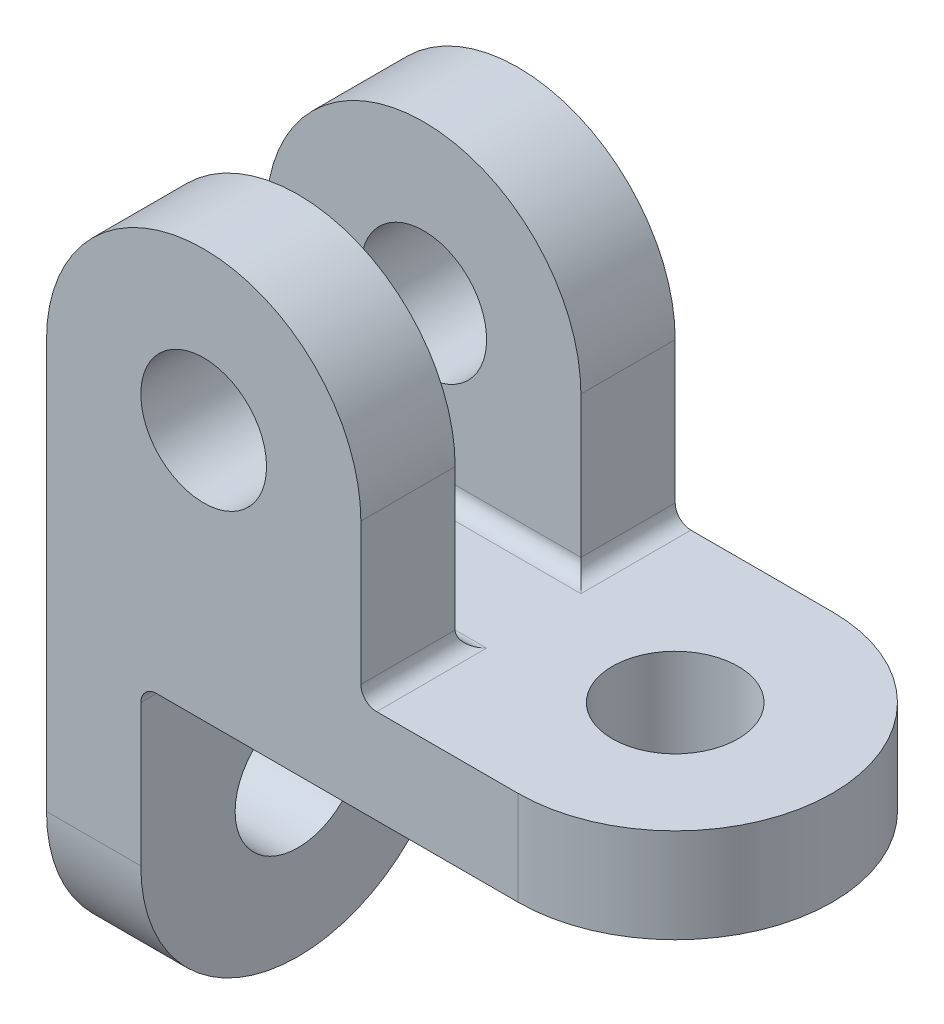
ISO-10303-21;
HEADER;
FILE_DESCRIPTION(('STEP AP214'),'2;1');
FILE_NAME('part.step','',(''),(''),'','','');
FILE_SCHEMA(('AUTOMOTIVE_DESIGN { 1 0 10303 214 1 1 1 1 }'));
ENDSEC;
DATA;
#1=APPLICATION_CONTEXT('core data for automotive mechanical design processes');
#2=APPLICATION_PROTOCOL_DEFINITION('international standard','automotive_design',2000,#1);
#3=PRODUCT_CONTEXT('',#1,'mechanical');
#4=PRODUCT('Part','Part','',(#3));
#5=PRODUCT_RELATED_PRODUCT_CATEGORY('part','',(#4));
#6=PRODUCT_DEFINITION_FORMATION('','',#4);
#7=PRODUCT_DEFINITION_CONTEXT('part definition',#1,'design');
#8=PRODUCT_DEFINITION('design','',#6,#7);
#9=PRODUCT_DEFINITION_SHAPE('','',#8);
#10=(LENGTH_UNIT() NAMED_UNIT(*) SI_UNIT(.MILLI.,.METRE.));
#11=(NAMED_UNIT(*) PLANE_ANGLE_UNIT() SI_UNIT($,.RADIAN.));
#12=(NAMED_UNIT(*) SI_UNIT($,.STERADIAN.) SOLID_ANGLE_UNIT());
#13=UNCERTAINTY_MEASURE_WITH_UNIT(LENGTH_MEASURE(1.E-05),#10,'distance_accuracy_value','');
#14=(GEOMETRIC_REPRESENTATION_CONTEXT(3) GLOBAL_UNCERTAINTY_ASSIGNED_CONTEXT((#13)) GLOBAL_UNIT_ASSIGNED_CONTEXT((#10,
#11,#12)) REPRESENTATION_CONTEXT('',''));
#15=CARTESIAN_POINT('',(0.,0.,0.));
#16=DIRECTION('',(0.,0.,1.));
#17=DIRECTION('',(1.,0.,0.));
#18=AXIS2_PLACEMENT_3D('',#15,#16,#17);
#19=CARTESIAN_POINT('',(30.,0.,0.));
#20=DIRECTION('',(0.,-1.,0.));
#21=DIRECTION('',(0.,0.,-1.));
#22=AXIS2_PLACEMENT_3D('',#19,#20,#21);
#23=PLANE('',#22);
#24=CARTESIAN_POINT('',(30.,0.,0.));
#25=DIRECTION('',(0.,1.,0.));
#26=DIRECTION('',(0.,0.,1.));
#27=AXIS2_PLACEMENT_3D('',#24,#25,#26);
#28=CIRCLE('',#27,8.);
#29=CARTESIAN_POINT('',(30.,0.,7.99999999999999));
#30=VERTEX_POINT('',#29);
#31=EDGE_CURVE('E236',#30,#30,#28,.T.);
#32=ORIENTED_EDGE('',*,*,#31,.T.);
#33=EDGE_LOOP('',(#32));
#34=FACE_BOUND('',#33,.T.);
#35=DIRECTION('',(1.,0.,0.));
#36=VECTOR('',#35,1.);
#37=CARTESIAN_POINT('',(-30.,0.,20.));
#38=LINE('',#37,#36);
#39=CARTESIAN_POINT('',(-16.,0.,20.));
#40=VERTEX_POINT('',#39);
#41=CARTESIAN_POINT('',(30.,0.,20.));
#42=VERTEX_POINT('',#41);
#43=EDGE_CURVE('E256',#40,#42,#38,.T.);
#44=ORIENTED_EDGE('',*,*,#43,.F.);
#45=DIRECTION('',(0.,0.,-1.));
#46=VECTOR('',#45,1.);
#47=CARTESIAN_POINT('',(-16.,0.,0.));
#48=LINE('',#47,#46);
#49=CARTESIAN_POINT('',(-16.,0.,-20.));
#50=VERTEX_POINT('',#49);
#51=EDGE_CURVE('E267',#40,#50,#48,.T.);
#52=ORIENTED_EDGE('',*,*,#51,.T.);
#53=DIRECTION('',(-1.,0.,0.));
#54=VECTOR('',#53,1.);
#55=CARTESIAN_POINT('',(30.,0.,-20.));
#56=LINE('',#55,#54);
#57=CARTESIAN_POINT('',(30.,0.,-20.));
#58=VERTEX_POINT('',#57);
#59=EDGE_CURVE('E239',#58,#50,#56,.T.);
#60=ORIENTED_EDGE('',*,*,#59,.F.);
#61=CARTESIAN_POINT('',(30.,0.,0.));
#62=DIRECTION('',(0.,1.,0.));
#63=DIRECTION('',(0.,0.,-1.));
#64=AXIS2_PLACEMENT_3D('',#61,#62,#63);
#65=CIRCLE('',#64,20.);
#66=EDGE_CURVE('E246',#42,#58,#65,.T.);
#67=ORIENTED_EDGE('',*,*,#66,.F.);
#68=EDGE_LOOP('',(#44,#52,#60,#67));
#69=FACE_BOUND('',#68,.T.);
#70=ADVANCED_FACE('F37',(#34,#69),#23,.T.);
#71=CARTESIAN_POINT('',(30.,12.,-20.));
#72=DIRECTION('',(0.,0.,1.));
#73=DIRECTION('',(1.,0.,0.));
#74=AXIS2_PLACEMENT_3D('',#71,#72,#73);
#75=PLANE('',#74);
#76=ORIENTED_EDGE('',*,*,#59,.T.);
#77=CARTESIAN_POINT('',(-16.,-2.,-20.));
#78=DIRECTION('',(0.,0.,1.));
#79=DIRECTION('',(1.,0.,0.));
#80=AXIS2_PLACEMENT_3D('',#77,#78,#79);
#81=CIRCLE('',#80,2.);
#82=CARTESIAN_POINT('',(-18.,-2.,-20.));
#83=VERTEX_POINT('',#82);
#84=EDGE_CURVE('E288',#50,#83,#81,.T.);
#85=ORIENTED_EDGE('',*,*,#84,.T.);
#86=DIRECTION('',(0.,-1.,0.));
#87=VECTOR('',#86,1.);
#88=CARTESIAN_POINT('',(-18.,-20.,-20.));
#89=LINE('',#88,#87);
#90=CARTESIAN_POINT('',(-18.,-20.,-20.));
#91=VERTEX_POINT('',#90);
#92=EDGE_CURVE('E165',#83,#91,#89,.T.);
#93=ORIENTED_EDGE('',*,*,#92,.T.);
#94=DIRECTION('',(-1.,0.,0.));
#95=VECTOR('',#94,1.);
#96=CARTESIAN_POINT('',(-18.,-20.,-20.));
#97=LINE('',#96,#95);
#98=CARTESIAN_POINT('',(-30.,-20.,-20.));
#99=VERTEX_POINT('',#98);
#100=EDGE_CURVE('E164',#91,#99,#97,.T.);
#101=ORIENTED_EDGE('',*,*,#100,.T.);
#102=DIRECTION('',(0.,-1.,0.));
#103=VECTOR('',#102,1.);
#104=CARTESIAN_POINT('',(-30.,12.,-20.));
#105=LINE('',#104,#103);
#106=CARTESIAN_POINT('',(-30.,32.,-20.));
#107=VERTEX_POINT('',#106);
#108=EDGE_CURVE('E265',#107,#99,#105,.T.);
#109=ORIENTED_EDGE('',*,*,#108,.F.);
#110=CARTESIAN_POINT('',(-10.,32.,-20.));
#111=DIRECTION('',(0.,0.,-1.));
#112=DIRECTION('',(1.,0.,0.));
#113=AXIS2_PLACEMENT_3D('',#110,#111,#112);
#114=CIRCLE('',#113,20.);
#115=CARTESIAN_POINT('',(10.,32.,-20.));
#116=VERTEX_POINT('',#115);
#117=EDGE_CURVE('E192',#107,#116,#114,.T.);
#118=ORIENTED_EDGE('',*,*,#117,.T.);
#119=DIRECTION('',(0.,-1.,0.));
#120=VECTOR('',#119,1.);
#121=CARTESIAN_POINT('',(10.,32.,-20.));
#122=LINE('',#121,#120);
#123=CARTESIAN_POINT('',(10.,14.,-20.));
#124=VERTEX_POINT('',#123);
#125=EDGE_CURVE('E199',#116,#124,#122,.T.);
#126=ORIENTED_EDGE('',*,*,#125,.T.);
#127=CARTESIAN_POINT('',(12.,14.,-20.));
#128=DIRECTION('',(0.,0.,1.));
#129=DIRECTION('',(1.,0.,0.));
#130=AXIS2_PLACEMENT_3D('',#127,#128,#129);
#131=CIRCLE('',#130,2.);
#132=CARTESIAN_POINT('',(12.,12.,-20.));
#133=VERTEX_POINT('',#132);
#134=EDGE_CURVE('E46',#124,#133,#131,.T.);
#135=ORIENTED_EDGE('',*,*,#134,.T.);
#136=DIRECTION('',(-1.,0.,0.));
#137=VECTOR('',#136,1.);
#138=CARTESIAN_POINT('',(30.,12.,-20.));
#139=LINE('',#138,#137);
#140=CARTESIAN_POINT('',(30.,12.,-20.));
#141=VERTEX_POINT('',#140);
#142=EDGE_CURVE('E242',#141,#133,#139,.T.);
#143=ORIENTED_EDGE('',*,*,#142,.F.);
#144=DIRECTION('',(0.,-1.,0.));
#145=VECTOR('',#144,1.);
#146=CARTESIAN_POINT('',(30.,12.,-20.));
#147=LINE('',#146,#145);
#148=EDGE_CURVE('E253',#141,#58,#147,.T.);
#149=ORIENTED_EDGE('',*,*,#148,.T.);
#150=EDGE_LOOP('',(#76,#85,#93,#101,#109,#118,#126,#135,#143,#149));
#151=FACE_BOUND('',#150,.T.);
#152=CARTESIAN_POINT('',(-10.,32.,-20.));
#153=DIRECTION('',(0.,0.,-1.));
#154=DIRECTION('',(-1.,0.,0.));
#155=AXIS2_PLACEMENT_3D('',#152,#153,#154);
#156=CIRCLE('',#155,8.);
#157=CARTESIAN_POINT('',(-18.,32.,-20.));
#158=VERTEX_POINT('',#157);
#159=EDGE_CURVE('E187',#158,#158,#156,.T.);
#160=ORIENTED_EDGE('',*,*,#159,.F.);
#161=EDGE_LOOP('',(#160));
#162=FACE_BOUND('',#161,.T.);
#163=ADVANCED_FACE('F314',(#151,#162),#75,.F.);
#164=CARTESIAN_POINT('',(-30.,12.,-20.));
#165=DIRECTION('',(1.,0.,0.));
#166=DIRECTION('',(0.,0.,-1.));
#167=AXIS2_PLACEMENT_3D('',#164,#165,#166);
#168=PLANE('',#167);
#169=ORIENTED_EDGE('',*,*,#108,.T.);
#170=CARTESIAN_POINT('',(-30.,-20.,0.));
#171=DIRECTION('',(-1.,0.,0.));
#172=DIRECTION('',(0.,0.,1.));
#173=AXIS2_PLACEMENT_3D('',#170,#171,#172);
#174=CIRCLE('',#173,20.);
#175=CARTESIAN_POINT('',(-30.,-20.,20.));
#176=VERTEX_POINT('',#175);
#177=EDGE_CURVE('E178',#99,#176,#174,.T.);
#178=ORIENTED_EDGE('',*,*,#177,.T.);
#179=DIRECTION('',(0.,-1.,0.));
#180=VECTOR('',#179,1.);
#181=CARTESIAN_POINT('',(-30.,12.,20.));
#182=LINE('',#181,#180);
#183=CARTESIAN_POINT('',(-30.,32.,20.));
#184=VERTEX_POINT('',#183);
#185=EDGE_CURVE('E159',#184,#176,#182,.T.);
#186=ORIENTED_EDGE('',*,*,#185,.F.);
#187=DIRECTION('',(0.,0.,1.));
#188=VECTOR('',#187,1.);
#189=CARTESIAN_POINT('',(-30.,32.,8.));
#190=LINE('',#189,#188);
#191=CARTESIAN_POINT('',(-30.,32.,8.));
#192=VERTEX_POINT('',#191);
#193=EDGE_CURVE('E227',#192,#184,#190,.T.);
#194=ORIENTED_EDGE('',*,*,#193,.F.);
#195=DIRECTION('',(0.,-1.,0.));
#196=VECTOR('',#195,1.);
#197=CARTESIAN_POINT('',(-30.,32.,8.));
#198=LINE('',#197,#196);
#199=CARTESIAN_POINT('',(-30.,14.,8.));
#200=VERTEX_POINT('',#199);
#201=EDGE_CURVE('E221',#192,#200,#198,.T.);
#202=ORIENTED_EDGE('',*,*,#201,.T.);
#203=CARTESIAN_POINT('',(-30.,14.,6.));
#204=DIRECTION('',(1.,0.,0.));
#205=DIRECTION('',(0.,0.,-1.));
#206=AXIS2_PLACEMENT_3D('',#203,#204,#205);
#207=CIRCLE('',#206,2.);
#208=CARTESIAN_POINT('',(-30.,12.,6.));
#209=VERTEX_POINT('',#208);
#210=EDGE_CURVE('E292',#200,#209,#207,.T.);
#211=ORIENTED_EDGE('',*,*,#210,.T.);
#212=DIRECTION('',(0.,0.,1.));
#213=VECTOR('',#212,1.);
#214=CARTESIAN_POINT('',(-30.,12.,-20.));
#215=LINE('',#214,#213);
#216=CARTESIAN_POINT('',(-30.,12.,-6.));
#217=VERTEX_POINT('',#216);
#218=EDGE_CURVE('E245',#217,#209,#215,.T.);
#219=ORIENTED_EDGE('',*,*,#218,.F.);
#220=CARTESIAN_POINT('',(-30.,14.,-6.));
#221=DIRECTION('',(1.,0.,0.));
#222=DIRECTION('',(0.,0.,-1.));
#223=AXIS2_PLACEMENT_3D('',#220,#221,#222);
#224=CIRCLE('',#223,2.);
#225=CARTESIAN_POINT('',(-30.,14.,-8.));
#226=VERTEX_POINT('',#225);
#227=EDGE_CURVE('E294',#217,#226,#224,.T.);
#228=ORIENTED_EDGE('',*,*,#227,.T.);
#229=DIRECTION('',(0.,1.,0.));
#230=VECTOR('',#229,1.);
#231=CARTESIAN_POINT('',(-30.,12.,-8.));
#232=LINE('',#231,#230);
#233=CARTESIAN_POINT('',(-30.,32.,-8.));
#234=VERTEX_POINT('',#233);
#235=EDGE_CURVE('E201',#226,#234,#232,.T.);
#236=ORIENTED_EDGE('',*,*,#235,.T.);
#237=DIRECTION('',(0.,0.,-1.));
#238=VECTOR('',#237,1.);
#239=CARTESIAN_POINT('',(-30.,32.,-8.));
#240=LINE('',#239,#238);
#241=EDGE_CURVE('E207',#234,#107,#240,.T.);
#242=ORIENTED_EDGE('',*,*,#241,.T.);
#243=EDGE_LOOP('',(#169,#178,#186,#194,#202,#211,#219,#228,#236,#242));
#244=FACE_BOUND('',#243,.T.);
#245=CARTESIAN_POINT('',(-30.,-20.,0.));
#246=DIRECTION('',(-1.,0.,0.));
#247=DIRECTION('',(0.,0.,1.));
#248=AXIS2_PLACEMENT_3D('',#245,#246,#247);
#249=CIRCLE('',#248,8.);
#250=CARTESIAN_POINT('',(-30.,-20.,8.));
#251=VERTEX_POINT('',#250);
#252=EDGE_CURVE('E183',#251,#251,#249,.T.);
#253=ORIENTED_EDGE('',*,*,#252,.F.);
#254=EDGE_LOOP('',(#253));
#255=FACE_BOUND('',#254,.T.);
#256=ADVANCED_FACE('F331',(#244,#255),#168,.F.);
#257=CARTESIAN_POINT('',(-30.,12.,20.));
#258=DIRECTION('',(0.,0.,-1.));
#259=DIRECTION('',(-1.,0.,0.));
#260=AXIS2_PLACEMENT_3D('',#257,#258,#259);
#261=PLANE('',#260);
#262=ORIENTED_EDGE('',*,*,#185,.T.);
#263=DIRECTION('',(-1.,0.,0.));
#264=VECTOR('',#263,1.);
#265=CARTESIAN_POINT('',(-18.,-20.,20.));
#266=LINE('',#265,#264);
#267=CARTESIAN_POINT('',(-18.,-20.,20.));
#268=VERTEX_POINT('',#267);
#269=EDGE_CURVE('E152',#268,#176,#266,.T.);
#270=ORIENTED_EDGE('',*,*,#269,.F.);
#271=DIRECTION('',(0.,1.,0.));
#272=VECTOR('',#271,1.);
#273=CARTESIAN_POINT('',(-18.,0.,20.));
#274=LINE('',#273,#272);
#275=CARTESIAN_POINT('',(-18.,-2.,20.));
#276=VERTEX_POINT('',#275);
#277=EDGE_CURVE('E156',#268,#276,#274,.T.);
#278=ORIENTED_EDGE('',*,*,#277,.T.);
#279=CARTESIAN_POINT('',(-16.,-2.,20.));
#280=DIRECTION('',(0.,0.,-1.));
#281=DIRECTION('',(-1.,0.,0.));
#282=AXIS2_PLACEMENT_3D('',#279,#280,#281);
#283=CIRCLE('',#282,2.);
#284=EDGE_CURVE('E290',#276,#40,#283,.T.);
#285=ORIENTED_EDGE('',*,*,#284,.T.);
#286=ORIENTED_EDGE('',*,*,#43,.T.);
#287=DIRECTION('',(0.,-1.,0.));
#288=VECTOR('',#287,1.);
#289=CARTESIAN_POINT('',(30.,12.,20.));
#290=LINE('',#289,#288);
#291=CARTESIAN_POINT('',(30.,12.,20.));
#292=VERTEX_POINT('',#291);
#293=EDGE_CURVE('E261',#292,#42,#290,.T.);
#294=ORIENTED_EDGE('',*,*,#293,.F.);
#295=DIRECTION('',(1.,0.,0.));
#296=VECTOR('',#295,1.);
#297=CARTESIAN_POINT('',(-30.,12.,20.));
#298=LINE('',#297,#296);
#299=CARTESIAN_POINT('',(12.,12.,20.));
#300=VERTEX_POINT('',#299);
#301=EDGE_CURVE('E249',#300,#292,#298,.T.);
#302=ORIENTED_EDGE('',*,*,#301,.F.);
#303=CARTESIAN_POINT('',(12.,14.,20.));
#304=DIRECTION('',(0.,0.,-1.));
#305=DIRECTION('',(-1.,0.,0.));
#306=AXIS2_PLACEMENT_3D('',#303,#304,#305);
#307=CIRCLE('',#306,2.);
#308=CARTESIAN_POINT('',(10.,14.,20.));
#309=VERTEX_POINT('',#308);
#310=EDGE_CURVE('E11',#300,#309,#307,.T.);
#311=ORIENTED_EDGE('',*,*,#310,.T.);
#312=DIRECTION('',(0.,1.,0.));
#313=VECTOR('',#312,1.);
#314=CARTESIAN_POINT('',(10.,12.,20.));
#315=LINE('',#314,#313);
#316=CARTESIAN_POINT('',(10.,32.,20.));
#317=VERTEX_POINT('',#316);
#318=EDGE_CURVE('E222',#309,#317,#315,.T.);
#319=ORIENTED_EDGE('',*,*,#318,.T.);
#320=CARTESIAN_POINT('',(-10.,32.,20.));
#321=DIRECTION('',(0.,0.,1.));
#322=DIRECTION('',(-1.,0.,0.));
#323=AXIS2_PLACEMENT_3D('',#320,#321,#322);
#324=CIRCLE('',#323,20.);
#325=EDGE_CURVE('E215',#317,#184,#324,.T.);
#326=ORIENTED_EDGE('',*,*,#325,.T.);
#327=EDGE_LOOP('',(#262,#270,#278,#285,#286,#294,#302,#311,#319,#326));
#328=FACE_BOUND('',#327,.T.);
#329=CARTESIAN_POINT('',(-10.,32.,20.));
#330=DIRECTION('',(0.,0.,1.));
#331=DIRECTION('',(1.,0.,0.));
#332=AXIS2_PLACEMENT_3D('',#329,#330,#331);
#333=CIRCLE('',#332,8.);
#334=CARTESIAN_POINT('',(-2.,32.,20.));
#335=VERTEX_POINT('',#334);
#336=EDGE_CURVE('E210',#335,#335,#333,.T.);
#337=ORIENTED_EDGE('',*,*,#336,.F.);
#338=EDGE_LOOP('',(#337));
#339=FACE_BOUND('',#338,.T.);
#340=ADVANCED_FACE('F154',(#328,#339),#261,.F.);
#341=CARTESIAN_POINT('',(30.,12.,0.));
#342=DIRECTION('',(0.,-1.,0.));
#343=DIRECTION('',(0.,0.,-1.));
#344=AXIS2_PLACEMENT_3D('',#341,#342,#343);
#345=CYLINDRICAL_SURFACE('',#344,20.);
#346=ORIENTED_EDGE('',*,*,#66,.T.);
#347=ORIENTED_EDGE('',*,*,#148,.F.);
#348=CARTESIAN_POINT('',(30.,12.,0.));
#349=DIRECTION('',(0.,1.,0.));
#350=DIRECTION('',(0.,0.,-1.));
#351=AXIS2_PLACEMENT_3D('',#348,#349,#350);
#352=CIRCLE('',#351,20.);
#353=EDGE_CURVE('E251',#292,#141,#352,.T.);
#354=ORIENTED_EDGE('',*,*,#353,.F.);
#355=ORIENTED_EDGE('',*,*,#293,.T.);
#356=EDGE_LOOP('',(#346,#347,#354,#355));
#357=FACE_BOUND('',#356,.T.);
#358=ADVANCED_FACE('F322',(#357),#345,.T.);
#359=CARTESIAN_POINT('',(30.,12.,0.));
#360=DIRECTION('',(0.,-1.,0.));
#361=DIRECTION('',(0.,0.,-1.));
#362=AXIS2_PLACEMENT_3D('',#359,#360,#361);
#363=PLANE('',#362);
#364=CARTESIAN_POINT('',(30.,12.,0.));
#365=DIRECTION('',(0.,1.,0.));
#366=DIRECTION('',(0.,0.,1.));
#367=AXIS2_PLACEMENT_3D('',#364,#365,#366);
#368=CIRCLE('',#367,8.);
#369=CARTESIAN_POINT('',(30.,12.,7.99999999999999));
#370=VERTEX_POINT('',#369);
#371=EDGE_CURVE('E233',#370,#370,#368,.T.);
#372=ORIENTED_EDGE('',*,*,#371,.F.);
#373=EDGE_LOOP('',(#372));
#374=FACE_BOUND('',#373,.T.);
#375=DIRECTION('',(0.,0.,-1.));
#376=VECTOR('',#375,1.);
#377=CARTESIAN_POINT('',(12.,12.,0.));
#378=LINE('',#377,#376);
#379=CARTESIAN_POINT('',(12.,12.,-6.00000000000001));
#380=VERTEX_POINT('',#379);
#381=EDGE_CURVE('E276',#133,#380,#378,.F.);
#382=ORIENTED_EDGE('',*,*,#381,.T.);
#383=DIRECTION('',(-1.,0.,0.));
#384=VECTOR('',#383,1.);
#385=CARTESIAN_POINT('',(30.,12.,-6.00000000000001));
#386=LINE('',#385,#384);
#387=EDGE_CURVE('E278',#380,#217,#386,.T.);
#388=ORIENTED_EDGE('',*,*,#387,.T.);
#389=ORIENTED_EDGE('',*,*,#218,.T.);
#390=DIRECTION('',(1.,0.,0.));
#391=VECTOR('',#390,1.);
#392=CARTESIAN_POINT('',(30.,12.,6.));
#393=LINE('',#392,#391);
#394=CARTESIAN_POINT('',(12.,12.,6.));
#395=VERTEX_POINT('',#394);
#396=EDGE_CURVE('E273',#209,#395,#393,.T.);
#397=ORIENTED_EDGE('',*,*,#396,.T.);
#398=DIRECTION('',(0.,0.,1.));
#399=VECTOR('',#398,1.);
#400=CARTESIAN_POINT('',(12.,12.,0.));
#401=LINE('',#400,#399);
#402=EDGE_CURVE('E271',#395,#300,#401,.T.);
#403=ORIENTED_EDGE('',*,*,#402,.T.);
#404=ORIENTED_EDGE('',*,*,#301,.T.);
#405=ORIENTED_EDGE('',*,*,#353,.T.);
#406=ORIENTED_EDGE('',*,*,#142,.T.);
#407=EDGE_LOOP('',(#382,#388,#389,#397,#403,#404,#405,#406));
#408=FACE_BOUND('',#407,.T.);
#409=ADVANCED_FACE('F317',(#374,#408),#363,.F.);
#410=CARTESIAN_POINT('',(30.,0.,0.));
#411=DIRECTION('',(0.,1.,0.));
#412=DIRECTION('',(0.,0.,1.));
#413=AXIS2_PLACEMENT_3D('',#410,#411,#412);
#414=CYLINDRICAL_SURFACE('',#413,8.);
#415=ORIENTED_EDGE('',*,*,#31,.F.);
#416=EDGE_LOOP('',(#415));
#417=FACE_BOUND('',#416,.T.);
#418=ORIENTED_EDGE('',*,*,#371,.T.);
#419=EDGE_LOOP('',(#418));
#420=FACE_BOUND('',#419,.T.);
#421=ADVANCED_FACE('F471',(#417,#420),#414,.F.);
#422=CARTESIAN_POINT('',(-10.,32.,8.));
#423=DIRECTION('',(0.,0.,1.));
#424=DIRECTION('',(1.,0.,0.));
#425=AXIS2_PLACEMENT_3D('',#422,#423,#424);
#426=CYLINDRICAL_SURFACE('',#425,20.);
#427=ORIENTED_EDGE('',*,*,#325,.F.);
#428=DIRECTION('',(0.,0.,1.));
#429=VECTOR('',#428,1.);
#430=CARTESIAN_POINT('',(10.,32.,8.));
#431=LINE('',#430,#429);
#432=CARTESIAN_POINT('',(10.,32.,8.));
#433=VERTEX_POINT('',#432);
#434=EDGE_CURVE('E230',#433,#317,#431,.T.);
#435=ORIENTED_EDGE('',*,*,#434,.F.);
#436=CARTESIAN_POINT('',(-10.,32.,8.));
#437=DIRECTION('',(0.,0.,1.));
#438=DIRECTION('',(-1.,0.,0.));
#439=AXIS2_PLACEMENT_3D('',#436,#437,#438);
#440=CIRCLE('',#439,20.);
#441=EDGE_CURVE('E218',#433,#192,#440,.T.);
#442=ORIENTED_EDGE('',*,*,#441,.T.);
#443=ORIENTED_EDGE('',*,*,#193,.T.);
#444=EDGE_LOOP('',(#427,#435,#442,#443));
#445=FACE_BOUND('',#444,.T.);
#446=ADVANCED_FACE('F458',(#445),#426,.T.);
#447=CARTESIAN_POINT('',(10.,12.,8.));
#448=DIRECTION('',(1.,0.,0.));
#449=DIRECTION('',(0.,0.,-1.));
#450=AXIS2_PLACEMENT_3D('',#447,#448,#449);
#451=PLANE('',#450);
#452=ORIENTED_EDGE('',*,*,#318,.F.);
#453=DIRECTION('',(0.,0.,1.));
#454=VECTOR('',#453,1.);
#455=CARTESIAN_POINT('',(10.,14.,8.));
#456=LINE('',#455,#454);
#457=CARTESIAN_POINT('',(10.,14.,8.));
#458=VERTEX_POINT('',#457);
#459=EDGE_CURVE('E286',#309,#458,#456,.F.);
#460=ORIENTED_EDGE('',*,*,#459,.T.);
#461=DIRECTION('',(0.,1.,0.));
#462=VECTOR('',#461,1.);
#463=CARTESIAN_POINT('',(10.,12.,8.));
#464=LINE('',#463,#462);
#465=EDGE_CURVE('E225',#458,#433,#464,.T.);
#466=ORIENTED_EDGE('',*,*,#465,.T.);
#467=ORIENTED_EDGE('',*,*,#434,.T.);
#468=EDGE_LOOP('',(#452,#460,#466,#467));
#469=FACE_BOUND('',#468,.T.);
#470=ADVANCED_FACE('F445',(#469),#451,.T.);
#471=CARTESIAN_POINT('',(-10.,32.,8.));
#472=DIRECTION('',(0.,0.,-1.));
#473=DIRECTION('',(-1.,0.,0.));
#474=AXIS2_PLACEMENT_3D('',#471,#472,#473);
#475=PLANE('',#474);
#476=CARTESIAN_POINT('',(-10.,32.,8.));
#477=DIRECTION('',(0.,0.,1.));
#478=DIRECTION('',(1.,0.,0.));
#479=AXIS2_PLACEMENT_3D('',#476,#477,#478);
#480=CIRCLE('',#479,8.);
#481=CARTESIAN_POINT('',(-2.,32.,8.));
#482=VERTEX_POINT('',#481);
#483=EDGE_CURVE('E212',#482,#482,#480,.T.);
#484=ORIENTED_EDGE('',*,*,#483,.T.);
#485=EDGE_LOOP('',(#484));
#486=FACE_BOUND('',#485,.T.);
#487=ORIENTED_EDGE('',*,*,#465,.F.);
#488=DIRECTION('',(1.,0.,0.));
#489=VECTOR('',#488,1.);
#490=CARTESIAN_POINT('',(-10.,14.,8.));
#491=LINE('',#490,#489);
#492=EDGE_CURVE('E281',#458,#200,#491,.F.);
#493=ORIENTED_EDGE('',*,*,#492,.T.);
#494=ORIENTED_EDGE('',*,*,#201,.F.);
#495=ORIENTED_EDGE('',*,*,#441,.F.);
#496=EDGE_LOOP('',(#487,#493,#494,#495));
#497=FACE_BOUND('',#496,.T.);
#498=ADVANCED_FACE('F440',(#486,#497),#475,.T.);
#499=CARTESIAN_POINT('',(-10.,32.,8.));
#500=DIRECTION('',(0.,0.,1.));
#501=DIRECTION('',(1.,0.,0.));
#502=AXIS2_PLACEMENT_3D('',#499,#500,#501);
#503=CYLINDRICAL_SURFACE('',#502,8.);
#504=ORIENTED_EDGE('',*,*,#483,.F.);
#505=EDGE_LOOP('',(#504));
#506=FACE_BOUND('',#505,.T.);
#507=ORIENTED_EDGE('',*,*,#336,.T.);
#508=EDGE_LOOP('',(#507));
#509=FACE_BOUND('',#508,.T.);
#510=ADVANCED_FACE('F351',(#506,#509),#503,.F.);
#511=CARTESIAN_POINT('',(-10.,32.,-8.));
#512=DIRECTION('',(0.,0.,-1.));
#513=DIRECTION('',(-1.,0.,0.));
#514=AXIS2_PLACEMENT_3D('',#511,#512,#513);
#515=CYLINDRICAL_SURFACE('',#514,20.);
#516=ORIENTED_EDGE('',*,*,#117,.F.);
#517=ORIENTED_EDGE('',*,*,#241,.F.);
#518=CARTESIAN_POINT('',(-10.,32.,-8.));
#519=DIRECTION('',(0.,0.,-1.));
#520=DIRECTION('',(1.,0.,0.));
#521=AXIS2_PLACEMENT_3D('',#518,#519,#520);
#522=CIRCLE('',#521,20.);
#523=CARTESIAN_POINT('',(10.,32.,-8.));
#524=VERTEX_POINT('',#523);
#525=EDGE_CURVE('E195',#234,#524,#522,.T.);
#526=ORIENTED_EDGE('',*,*,#525,.T.);
#527=DIRECTION('',(0.,0.,-1.));
#528=VECTOR('',#527,1.);
#529=CARTESIAN_POINT('',(10.,32.,-8.));
#530=LINE('',#529,#528);
#531=EDGE_CURVE('E203',#524,#116,#530,.T.);
#532=ORIENTED_EDGE('',*,*,#531,.T.);
#533=EDGE_LOOP('',(#516,#517,#526,#532));
#534=FACE_BOUND('',#533,.T.);
#535=ADVANCED_FACE('F338',(#534),#515,.T.);
#536=CARTESIAN_POINT('',(10.,32.,-8.));
#537=DIRECTION('',(1.,0.,0.));
#538=DIRECTION('',(0.,0.,-1.));
#539=AXIS2_PLACEMENT_3D('',#536,#537,#538);
#540=PLANE('',#539);
#541=DIRECTION('',(0.,-1.,0.));
#542=VECTOR('',#541,1.);
#543=CARTESIAN_POINT('',(10.,32.,-8.));
#544=LINE('',#543,#542);
#545=CARTESIAN_POINT('',(10.,14.,-8.));
#546=VERTEX_POINT('',#545);
#547=EDGE_CURVE('E198',#524,#546,#544,.T.);
#548=ORIENTED_EDGE('',*,*,#547,.T.);
#549=DIRECTION('',(0.,0.,-1.));
#550=VECTOR('',#549,1.);
#551=CARTESIAN_POINT('',(10.,14.,-8.));
#552=LINE('',#551,#550);
#553=EDGE_CURVE('E60',#546,#124,#552,.T.);
#554=ORIENTED_EDGE('',*,*,#553,.T.);
#555=ORIENTED_EDGE('',*,*,#125,.F.);
#556=ORIENTED_EDGE('',*,*,#531,.F.);
#557=EDGE_LOOP('',(#548,#554,#555,#556));
#558=FACE_BOUND('',#557,.T.);
#559=ADVANCED_FACE('F340',(#558),#540,.T.);
#560=CARTESIAN_POINT('',(-10.,32.,-8.));
#561=DIRECTION('',(0.,0.,1.));
#562=DIRECTION('',(1.,0.,0.));
#563=AXIS2_PLACEMENT_3D('',#560,#561,#562);
#564=PLANE('',#563);
#565=CARTESIAN_POINT('',(-10.,32.,-8.));
#566=DIRECTION('',(0.,0.,-1.));
#567=DIRECTION('',(-1.,0.,0.));
#568=AXIS2_PLACEMENT_3D('',#565,#566,#567);
#569=CIRCLE('',#568,8.);
#570=CARTESIAN_POINT('',(-18.,32.,-8.));
#571=VERTEX_POINT('',#570);
#572=EDGE_CURVE('E189',#571,#571,#569,.T.);
#573=ORIENTED_EDGE('',*,*,#572,.T.);
#574=EDGE_LOOP('',(#573));
#575=FACE_BOUND('',#574,.T.);
#576=ORIENTED_EDGE('',*,*,#235,.F.);
#577=DIRECTION('',(-1.,0.,0.));
#578=VECTOR('',#577,1.);
#579=CARTESIAN_POINT('',(-10.,14.,-8.));
#580=LINE('',#579,#578);
#581=EDGE_CURVE('E283',#226,#546,#580,.F.);
#582=ORIENTED_EDGE('',*,*,#581,.T.);
#583=ORIENTED_EDGE('',*,*,#547,.F.);
#584=ORIENTED_EDGE('',*,*,#525,.F.);
#585=EDGE_LOOP('',(#576,#582,#583,#584));
#586=FACE_BOUND('',#585,.T.);
#587=ADVANCED_FACE('F342',(#575,#586),#564,.T.);
#588=CARTESIAN_POINT('',(-10.,32.,-8.));
#589=DIRECTION('',(0.,0.,-1.));
#590=DIRECTION('',(-1.,0.,0.));
#591=AXIS2_PLACEMENT_3D('',#588,#589,#590);
#592=CYLINDRICAL_SURFACE('',#591,8.);
#593=ORIENTED_EDGE('',*,*,#572,.F.);
#594=EDGE_LOOP('',(#593));
#595=FACE_BOUND('',#594,.T.);
#596=ORIENTED_EDGE('',*,*,#159,.T.);
#597=EDGE_LOOP('',(#596));
#598=FACE_BOUND('',#597,.T.);
#599=ADVANCED_FACE('F348',(#595,#598),#592,.F.);
#600=CARTESIAN_POINT('',(-18.,-20.,0.));
#601=DIRECTION('',(-1.,0.,0.));
#602=DIRECTION('',(0.,0.,1.));
#603=AXIS2_PLACEMENT_3D('',#600,#601,#602);
#604=CYLINDRICAL_SURFACE('',#603,20.);
#605=ORIENTED_EDGE('',*,*,#177,.F.);
#606=ORIENTED_EDGE('',*,*,#100,.F.);
#607=CARTESIAN_POINT('',(-18.,-20.,0.));
#608=DIRECTION('',(-1.,0.,0.));
#609=DIRECTION('',(0.,0.,1.));
#610=AXIS2_PLACEMENT_3D('',#607,#608,#609);
#611=CIRCLE('',#610,20.);
#612=EDGE_CURVE('E171',#91,#268,#611,.T.);
#613=ORIENTED_EDGE('',*,*,#612,.T.);
#614=ORIENTED_EDGE('',*,*,#269,.T.);
#615=EDGE_LOOP('',(#605,#606,#613,#614));
#616=FACE_BOUND('',#615,.T.);
#617=ADVANCED_FACE('F176',(#616),#604,.T.);
#618=CARTESIAN_POINT('',(-18.,-20.,0.));
#619=DIRECTION('',(-1.,0.,0.));
#620=DIRECTION('',(0.,0.,1.));
#621=AXIS2_PLACEMENT_3D('',#618,#619,#620);
#622=PLANE('',#621);
#623=CARTESIAN_POINT('',(-18.,-20.,0.));
#624=DIRECTION('',(-1.,0.,0.));
#625=DIRECTION('',(0.,0.,1.));
#626=AXIS2_PLACEMENT_3D('',#623,#624,#625);
#627=CIRCLE('',#626,8.);
#628=CARTESIAN_POINT('',(-18.,-20.,8.));
#629=VERTEX_POINT('',#628);
#630=EDGE_CURVE('E180',#629,#629,#627,.T.);
#631=ORIENTED_EDGE('',*,*,#630,.T.);
#632=EDGE_LOOP('',(#631));
#633=FACE_BOUND('',#632,.T.);
#634=ORIENTED_EDGE('',*,*,#92,.F.);
#635=DIRECTION('',(0.,0.,-1.));
#636=VECTOR('',#635,1.);
#637=CARTESIAN_POINT('',(-18.,-2.,0.));
#638=LINE('',#637,#636);
#639=EDGE_CURVE('E173',#83,#276,#638,.F.);
#640=ORIENTED_EDGE('',*,*,#639,.T.);
#641=ORIENTED_EDGE('',*,*,#277,.F.);
#642=ORIENTED_EDGE('',*,*,#612,.F.);
#643=EDGE_LOOP('',(#634,#640,#641,#642));
#644=FACE_BOUND('',#643,.T.);
#645=ADVANCED_FACE('F170',(#633,#644),#622,.F.);
#646=CARTESIAN_POINT('',(-18.,-20.,0.));
#647=DIRECTION('',(-1.,0.,0.));
#648=DIRECTION('',(0.,0.,1.));
#649=AXIS2_PLACEMENT_3D('',#646,#647,#648);
#650=CYLINDRICAL_SURFACE('',#649,8.);
#651=ORIENTED_EDGE('',*,*,#630,.F.);
#652=EDGE_LOOP('',(#651));
#653=FACE_BOUND('',#652,.T.);
#654=ORIENTED_EDGE('',*,*,#252,.T.);
#655=EDGE_LOOP('',(#654));
#656=FACE_BOUND('',#655,.T.);
#657=ADVANCED_FACE('F372',(#653,#656),#650,.F.);
#658=CARTESIAN_POINT('',(-16.,-2.,0.));
#659=DIRECTION('',(0.,0.,-1.));
#660=DIRECTION('',(-1.,0.,0.));
#661=AXIS2_PLACEMENT_3D('',#658,#659,#660);
#662=CYLINDRICAL_SURFACE('',#661,2.);
#663=ORIENTED_EDGE('',*,*,#284,.F.);
#664=ORIENTED_EDGE('',*,*,#639,.F.);
#665=ORIENTED_EDGE('',*,*,#84,.F.);
#666=ORIENTED_EDGE('',*,*,#51,.F.);
#667=EDGE_LOOP('',(#663,#664,#665,#666));
#668=FACE_BOUND('',#667,.T.);
#669=ADVANCED_FACE('F329',(#668),#662,.F.);
#670=CARTESIAN_POINT('',(12.,14.,0.));
#671=DIRECTION('',(0.,0.,1.));
#672=DIRECTION('',(1.,0.,0.));
#673=AXIS2_PLACEMENT_3D('',#670,#671,#672);
#674=CYLINDRICAL_SURFACE('',#673,2.);
#675=ORIENTED_EDGE('',*,*,#310,.F.);
#676=ORIENTED_EDGE('',*,*,#402,.F.);
#677=CARTESIAN_POINT('',(12.,14.,6.));
#678=DIRECTION('',(0.707106781186547,0.,0.707106781186547));
#679=DIRECTION('',(-0.707106781186547,0.,0.707106781186547));
#680=AXIS2_PLACEMENT_3D('',#677,#678,#679);
#681=ELLIPSE('',#680,2.82842712474619,2.);
#682=EDGE_CURVE('E296',#458,#395,#681,.T.);
#683=ORIENTED_EDGE('',*,*,#682,.F.);
#684=ORIENTED_EDGE('',*,*,#459,.F.);
#685=EDGE_LOOP('',(#675,#676,#683,#684));
#686=FACE_BOUND('',#685,.T.);
#687=ADVANCED_FACE('F371',(#686),#674,.F.);
#688=CARTESIAN_POINT('',(30.,14.,6.));
#689=DIRECTION('',(1.,0.,0.));
#690=DIRECTION('',(0.,0.,-1.));
#691=AXIS2_PLACEMENT_3D('',#688,#689,#690);
#692=CYLINDRICAL_SURFACE('',#691,2.);
#693=ORIENTED_EDGE('',*,*,#210,.F.);
#694=ORIENTED_EDGE('',*,*,#492,.F.);
#695=ORIENTED_EDGE('',*,*,#682,.T.);
#696=ORIENTED_EDGE('',*,*,#396,.F.);
#697=EDGE_LOOP('',(#693,#694,#695,#696));
#698=FACE_BOUND('',#697,.T.);
#699=ADVANCED_FACE('F373',(#698),#692,.F.);
#700=CARTESIAN_POINT('',(12.,14.,-8.));
#701=DIRECTION('',(0.,0.,-1.));
#702=DIRECTION('',(-1.,0.,0.));
#703=AXIS2_PLACEMENT_3D('',#700,#701,#702);
#704=CYLINDRICAL_SURFACE('',#703,2.);
#705=ORIENTED_EDGE('',*,*,#134,.F.);
#706=ORIENTED_EDGE('',*,*,#553,.F.);
#707=CARTESIAN_POINT('',(12.,14.,-6.00000000000001));
#708=DIRECTION('',(0.707106781186547,0.,-0.707106781186548));
#709=DIRECTION('',(-0.707106781186548,0.,-0.707106781186547));
#710=AXIS2_PLACEMENT_3D('',#707,#708,#709);
#711=ELLIPSE('',#710,2.82842712474619,2.);
#712=EDGE_CURVE('E41',#380,#546,#711,.T.);
#713=ORIENTED_EDGE('',*,*,#712,.F.);
#714=ORIENTED_EDGE('',*,*,#381,.F.);
#715=EDGE_LOOP('',(#705,#706,#713,#714));
#716=FACE_BOUND('',#715,.T.);
#717=ADVANCED_FACE('F39',(#716),#704,.F.);
#718=CARTESIAN_POINT('',(30.,14.,-6.00000000000001));
#719=DIRECTION('',(-1.,0.,0.));
#720=DIRECTION('',(0.,0.,1.));
#721=AXIS2_PLACEMENT_3D('',#718,#719,#720);
#722=CYLINDRICAL_SURFACE('',#721,2.);
#723=ORIENTED_EDGE('',*,*,#712,.T.);
#724=ORIENTED_EDGE('',*,*,#581,.F.);
#725=ORIENTED_EDGE('',*,*,#227,.F.);
#726=ORIENTED_EDGE('',*,*,#387,.F.);
#727=EDGE_LOOP('',(#723,#724,#725,#726));
#728=FACE_BOUND('',#727,.T.);
#729=ADVANCED_FACE('F308',(#728),#722,.F.);
#730=CLOSED_SHELL('',(#70,#163,#256,#340,#358,#409,#421,#446,#470,#498,#510,#535,#559,#587,#599,
#617,#645,#657,#669,#687,#699,#717,#729));
#731=MANIFOLD_SOLID_BREP('B2',#730);
#732=ADVANCED_BREP_SHAPE_REPRESENTATION('',(#18,#731),#14);
#733=SHAPE_DEFINITION_REPRESENTATION(#9,#732);
ENDSEC;
END-ISO-10303-21;
